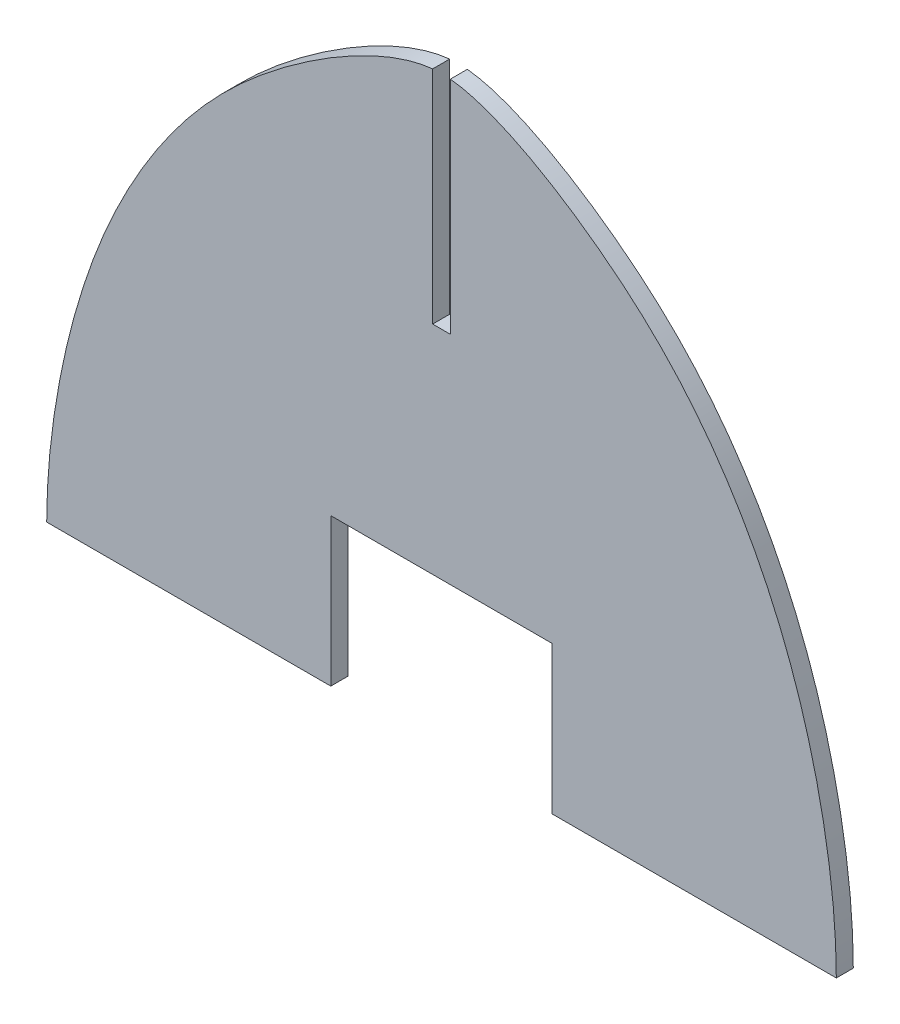
ISO-10303-21;
HEADER;
FILE_DESCRIPTION(('STEP AP214'),'2;1');
FILE_NAME('part.step','',(''),(''),'','','');
FILE_SCHEMA(('AUTOMOTIVE_DESIGN { 1 0 10303 214 1 1 1 1 }'));
ENDSEC;
DATA;
#1=APPLICATION_CONTEXT('core data for automotive mechanical design processes');
#2=APPLICATION_PROTOCOL_DEFINITION('international standard','automotive_design',2000,#1);
#3=PRODUCT_CONTEXT('',#1,'mechanical');
#4=PRODUCT('Part','Part','',(#3));
#5=PRODUCT_RELATED_PRODUCT_CATEGORY('part','',(#4));
#6=PRODUCT_DEFINITION_FORMATION('','',#4);
#7=PRODUCT_DEFINITION_CONTEXT('part definition',#1,'design');
#8=PRODUCT_DEFINITION('design','',#6,#7);
#9=PRODUCT_DEFINITION_SHAPE('','',#8);
#10=(LENGTH_UNIT() NAMED_UNIT(*) SI_UNIT(.MILLI.,.METRE.));
#11=(NAMED_UNIT(*) PLANE_ANGLE_UNIT() SI_UNIT($,.RADIAN.));
#12=(NAMED_UNIT(*) SI_UNIT($,.STERADIAN.) SOLID_ANGLE_UNIT());
#13=UNCERTAINTY_MEASURE_WITH_UNIT(LENGTH_MEASURE(1.E-05),#10,'distance_accuracy_value','');
#14=(GEOMETRIC_REPRESENTATION_CONTEXT(3) GLOBAL_UNCERTAINTY_ASSIGNED_CONTEXT((#13)) GLOBAL_UNIT_ASSIGNED_CONTEXT((#10,
#11,#12)) REPRESENTATION_CONTEXT('',''));
#15=CARTESIAN_POINT('',(0.,0.,0.));
#16=DIRECTION('',(0.,0.,1.));
#17=DIRECTION('',(1.,0.,0.));
#18=AXIS2_PLACEMENT_3D('',#15,#16,#17);
#19=CARTESIAN_POINT('',(101.35726270101,164.25702439015,5.842));
#20=DIRECTION('',(0.,0.,1.));
#21=DIRECTION('',(1.,0.,0.));
#22=AXIS2_PLACEMENT_3D('',#19,#20,#21);
#23=PLANE('',#22);
#24=DIRECTION('',(0.,1.,0.));
#25=VECTOR('',#24,1.);
#26=CARTESIAN_POINT('',(3.048,241.3,5.842));
#27=LINE('',#26,#25);
#28=CARTESIAN_POINT('',(3.04800000000001,165.1,5.842));
#29=VERTEX_POINT('',#28);
#30=CARTESIAN_POINT('',(3.04799999980485,241.141961047709,5.842));
#31=VERTEX_POINT('',#30);
#32=EDGE_CURVE('E48',#29,#31,#27,.T.);
#33=ORIENTED_EDGE('',*,*,#32,.F.);
#34=DIRECTION('',(1.,0.,0.));
#35=VECTOR('',#34,1.);
#36=CARTESIAN_POINT('',(0.,165.1,5.842));
#37=LINE('',#36,#35);
#38=CARTESIAN_POINT('',(-3.04800000000001,165.1,5.842));
#39=VERTEX_POINT('',#38);
#40=EDGE_CURVE('E111',#39,#29,#37,.T.);
#41=ORIENTED_EDGE('',*,*,#40,.F.);
#42=DIRECTION('',(0.,1.,0.));
#43=VECTOR('',#42,1.);
#44=CARTESIAN_POINT('',(-3.048,241.3,5.842));
#45=LINE('',#44,#43);
#46=CARTESIAN_POINT('',(-3.04799999980485,241.141961047709,5.842));
#47=VERTEX_POINT('',#46);
#48=EDGE_CURVE('E115',#39,#47,#45,.T.);
#49=ORIENTED_EDGE('',*,*,#48,.T.);
#50=CARTESIAN_POINT('',(-135.847173209284,39.6875,5.842));
#51=CARTESIAN_POINT('',(-135.847173209284,66.0913289734383,5.842));
#52=CARTESIAN_POINT('',(-127.183964055837,115.738105555344,5.842));
#53=CARTESIAN_POINT('',(-96.7697664193962,175.903175741918,5.842));
#54=CARTESIAN_POINT('',(-59.624010151385,216.373546587046,5.842));
#55=CARTESIAN_POINT('',(-14.7383543797636,241.3,5.842));
#56=CARTESIAN_POINT('',(0.,241.3,5.842));
#57=B_SPLINE_CURVE_WITH_KNOTS('',3,(#50,#51,#52,#53,#54,#55,#56),.UNSPECIFIED.,.F.,.F.,(4,1,1,1,
4),(0.,0.338781958063349,0.527407096560456,0.772270466293324,1.),.UNSPECIFIED.);
#58=CARTESIAN_POINT('',(-135.847173209284,39.6875,5.842));
#59=VERTEX_POINT('',#58);
#60=EDGE_CURVE('E147',#59,#47,#57,.T.);
#61=ORIENTED_EDGE('',*,*,#60,.F.);
#62=DIRECTION('',(-1.,0.,0.));
#63=VECTOR('',#62,1.);
#64=CARTESIAN_POINT('',(0.,39.6875,5.842));
#65=LINE('',#64,#63);
#66=CARTESIAN_POINT('',(-38.1,39.6875,5.842));
#67=VERTEX_POINT('',#66);
#68=EDGE_CURVE('E152',#67,#59,#65,.T.);
#69=ORIENTED_EDGE('',*,*,#68,.F.);
#70=DIRECTION('',(0.,1.,0.));
#71=VECTOR('',#70,1.);
#72=CARTESIAN_POINT('',(-38.1,39.6875,5.842));
#73=LINE('',#72,#71);
#74=CARTESIAN_POINT('',(-38.1,90.4875,5.842));
#75=VERTEX_POINT('',#74);
#76=EDGE_CURVE('E136',#67,#75,#73,.T.);
#77=ORIENTED_EDGE('',*,*,#76,.T.);
#78=DIRECTION('',(-1.,0.,0.));
#79=VECTOR('',#78,1.);
#80=CARTESIAN_POINT('',(0.,90.4875,5.842));
#81=LINE('',#80,#79);
#82=CARTESIAN_POINT('',(38.1,90.4875,5.842));
#83=VERTEX_POINT('',#82);
#84=EDGE_CURVE('E219',#83,#75,#81,.T.);
#85=ORIENTED_EDGE('',*,*,#84,.F.);
#86=DIRECTION('',(0.,1.,0.));
#87=VECTOR('',#86,1.);
#88=CARTESIAN_POINT('',(38.1,39.6875,5.842));
#89=LINE('',#88,#87);
#90=CARTESIAN_POINT('',(38.1,39.6875,5.842));
#91=VERTEX_POINT('',#90);
#92=EDGE_CURVE('E222',#91,#83,#89,.T.);
#93=ORIENTED_EDGE('',*,*,#92,.F.);
#94=DIRECTION('',(1.,0.,0.));
#95=VECTOR('',#94,1.);
#96=CARTESIAN_POINT('',(0.,39.6875,5.842));
#97=LINE('',#96,#95);
#98=CARTESIAN_POINT('',(135.847173209284,39.6875,5.842));
#99=VERTEX_POINT('',#98);
#100=EDGE_CURVE('E57',#91,#99,#97,.T.);
#101=ORIENTED_EDGE('',*,*,#100,.T.);
#102=CARTESIAN_POINT('',(135.847173209284,39.6875,5.842));
#103=CARTESIAN_POINT('',(135.847173209284,66.0913289734383,5.842));
#104=CARTESIAN_POINT('',(127.183964055837,115.738105555344,5.842));
#105=CARTESIAN_POINT('',(96.7697664193962,175.903175741918,5.842));
#106=CARTESIAN_POINT('',(59.624010151385,216.373546587046,5.842));
#107=CARTESIAN_POINT('',(14.7383543797636,241.3,5.842));
#108=CARTESIAN_POINT('',(0.,241.3,5.842));
#109=B_SPLINE_CURVE_WITH_KNOTS('',3,(#102,#103,#104,#105,#106,#107,#108),.UNSPECIFIED.,.F.,.F.,
(4,1,1,1,4),(0.,0.338781958063349,0.527407096560456,0.772270466293324,1.),.UNSPECIFIED.);
#110=EDGE_CURVE('E204',#99,#31,#109,.T.);
#111=ORIENTED_EDGE('',*,*,#110,.T.);
#112=EDGE_LOOP('',(#33,#41,#49,#61,#69,#77,#85,#93,#101,#111));
#113=FACE_BOUND('',#112,.T.);
#114=ADVANCED_FACE('F33',(#113),#23,.T.);
#115=CARTESIAN_POINT('',(101.35726270101,164.25702439015,0.));
#116=DIRECTION('',(0.,0.,1.));
#117=DIRECTION('',(1.,0.,0.));
#118=AXIS2_PLACEMENT_3D('',#115,#116,#117);
#119=PLANE('',#118);
#120=DIRECTION('',(1.,0.,0.));
#121=VECTOR('',#120,1.);
#122=CARTESIAN_POINT('',(0.,165.1,0.));
#123=LINE('',#122,#121);
#124=CARTESIAN_POINT('',(-3.04800000000001,165.1,0.));
#125=VERTEX_POINT('',#124);
#126=CARTESIAN_POINT('',(3.04800000000001,165.1,0.));
#127=VERTEX_POINT('',#126);
#128=EDGE_CURVE('E123',#125,#127,#123,.T.);
#129=ORIENTED_EDGE('',*,*,#128,.T.);
#130=DIRECTION('',(0.,1.,0.));
#131=VECTOR('',#130,1.);
#132=CARTESIAN_POINT('',(3.048,241.3,0.));
#133=LINE('',#132,#131);
#134=CARTESIAN_POINT('',(3.048,241.141961047709,0.));
#135=VERTEX_POINT('',#134);
#136=EDGE_CURVE('E117',#127,#135,#133,.T.);
#137=ORIENTED_EDGE('',*,*,#136,.T.);
#138=CARTESIAN_POINT('',(135.847173209284,39.6875,0.));
#139=CARTESIAN_POINT('',(135.847173209284,66.0913289734383,0.));
#140=CARTESIAN_POINT('',(127.183964055837,115.738105555344,0.));
#141=CARTESIAN_POINT('',(96.7697664193962,175.903175741918,0.));
#142=CARTESIAN_POINT('',(59.624010151385,216.373546587046,0.));
#143=CARTESIAN_POINT('',(14.7383543797636,241.3,0.));
#144=CARTESIAN_POINT('',(0.,241.3,0.));
#145=B_SPLINE_CURVE_WITH_KNOTS('',3,(#138,#139,#140,#141,#142,#143,#144),.UNSPECIFIED.,.F.,.F.,
(4,1,1,1,4),(0.,0.338781958063349,0.527407096560456,0.772270466293324,1.),.UNSPECIFIED.);
#146=CARTESIAN_POINT('',(135.847173209284,39.6875,0.));
#147=VERTEX_POINT('',#146);
#148=EDGE_CURVE('E196',#147,#135,#145,.T.);
#149=ORIENTED_EDGE('',*,*,#148,.F.);
#150=DIRECTION('',(1.,0.,0.));
#151=VECTOR('',#150,1.);
#152=CARTESIAN_POINT('',(0.,39.6875,0.));
#153=LINE('',#152,#151);
#154=CARTESIAN_POINT('',(38.1,39.6875,0.));
#155=VERTEX_POINT('',#154);
#156=EDGE_CURVE('E194',#155,#147,#153,.T.);
#157=ORIENTED_EDGE('',*,*,#156,.F.);
#158=DIRECTION('',(0.,1.,0.));
#159=VECTOR('',#158,1.);
#160=CARTESIAN_POINT('',(38.1,39.6875,0.));
#161=LINE('',#160,#159);
#162=CARTESIAN_POINT('',(38.1,90.4875,0.));
#163=VERTEX_POINT('',#162);
#164=EDGE_CURVE('E201',#155,#163,#161,.T.);
#165=ORIENTED_EDGE('',*,*,#164,.T.);
#166=DIRECTION('',(-1.,0.,0.));
#167=VECTOR('',#166,1.);
#168=CARTESIAN_POINT('',(0.,90.4875,0.));
#169=LINE('',#168,#167);
#170=CARTESIAN_POINT('',(-38.1,90.4875,0.));
#171=VERTEX_POINT('',#170);
#172=EDGE_CURVE('E220',#163,#171,#169,.T.);
#173=ORIENTED_EDGE('',*,*,#172,.T.);
#174=DIRECTION('',(0.,1.,0.));
#175=VECTOR('',#174,1.);
#176=CARTESIAN_POINT('',(-38.1,39.6875,0.));
#177=LINE('',#176,#175);
#178=CARTESIAN_POINT('',(-38.1,39.6875,0.));
#179=VERTEX_POINT('',#178);
#180=EDGE_CURVE('E127',#179,#171,#177,.T.);
#181=ORIENTED_EDGE('',*,*,#180,.F.);
#182=DIRECTION('',(-1.,0.,0.));
#183=VECTOR('',#182,1.);
#184=CARTESIAN_POINT('',(0.,39.6875,0.));
#185=LINE('',#184,#183);
#186=CARTESIAN_POINT('',(-135.847173209284,39.6875,0.));
#187=VERTEX_POINT('',#186);
#188=EDGE_CURVE('E153',#179,#187,#185,.T.);
#189=ORIENTED_EDGE('',*,*,#188,.T.);
#190=CARTESIAN_POINT('',(-135.847173209284,39.6875,0.));
#191=CARTESIAN_POINT('',(-135.847173209284,66.0913289734383,0.));
#192=CARTESIAN_POINT('',(-127.183964055837,115.738105555344,0.));
#193=CARTESIAN_POINT('',(-96.7697664193962,175.903175741918,0.));
#194=CARTESIAN_POINT('',(-59.624010151385,216.373546587046,0.));
#195=CARTESIAN_POINT('',(-14.7383543797636,241.3,0.));
#196=CARTESIAN_POINT('',(0.,241.3,0.));
#197=B_SPLINE_CURVE_WITH_KNOTS('',3,(#190,#191,#192,#193,#194,#195,#196),.UNSPECIFIED.,.F.,.F.,
(4,1,1,1,4),(0.,0.338781958063349,0.527407096560456,0.772270466293324,1.),.UNSPECIFIED.);
#198=CARTESIAN_POINT('',(-3.048,241.141961047709,0.));
#199=VERTEX_POINT('',#198);
#200=EDGE_CURVE('E146',#187,#199,#197,.T.);
#201=ORIENTED_EDGE('',*,*,#200,.T.);
#202=DIRECTION('',(0.,1.,0.));
#203=VECTOR('',#202,1.);
#204=CARTESIAN_POINT('',(-3.048,241.3,0.));
#205=LINE('',#204,#203);
#206=EDGE_CURVE('E132',#125,#199,#205,.T.);
#207=ORIENTED_EDGE('',*,*,#206,.F.);
#208=EDGE_LOOP('',(#129,#137,#149,#157,#165,#173,#181,#189,#201,#207));
#209=FACE_BOUND('',#208,.T.);
#210=ADVANCED_FACE('F182',(#209),#119,.F.);
#211=DIRECTION('',(0.,0.,-1.));
#212=VECTOR('',#211,1.);
#213=SURFACE_OF_LINEAR_EXTRUSION('',#109,#212);
#214=DIRECTION('',(0.,0.,-1.));
#215=VECTOR('',#214,1.);
#216=CARTESIAN_POINT('',(3.04799999999999,241.14196104769,5.842));
#217=LINE('',#216,#215);
#218=EDGE_CURVE('E11',#31,#135,#217,.T.);
#219=ORIENTED_EDGE('',*,*,#218,.F.);
#220=ORIENTED_EDGE('',*,*,#110,.F.);
#221=DIRECTION('',(0.,0.,-1.));
#222=VECTOR('',#221,1.);
#223=CARTESIAN_POINT('',(135.847173209284,39.6875,5.842));
#224=LINE('',#223,#222);
#225=EDGE_CURVE('E42',#99,#147,#224,.T.);
#226=ORIENTED_EDGE('',*,*,#225,.T.);
#227=ORIENTED_EDGE('',*,*,#148,.T.);
#228=EDGE_LOOP('',(#219,#220,#226,#227));
#229=FACE_BOUND('',#228,.T.);
#230=ADVANCED_FACE('F35',(#229),#213,.F.);
#231=CARTESIAN_POINT('',(0.,39.6875,5.842));
#232=DIRECTION('',(0.,1.,0.));
#233=DIRECTION('',(0.,0.,1.));
#234=AXIS2_PLACEMENT_3D('',#231,#232,#233);
#235=PLANE('',#234);
#236=DIRECTION('',(0.,0.,-1.));
#237=VECTOR('',#236,1.);
#238=CARTESIAN_POINT('',(38.1,39.6875,5.842));
#239=LINE('',#238,#237);
#240=EDGE_CURVE('E192',#91,#155,#239,.T.);
#241=ORIENTED_EDGE('',*,*,#240,.T.);
#242=ORIENTED_EDGE('',*,*,#156,.T.);
#243=ORIENTED_EDGE('',*,*,#225,.F.);
#244=ORIENTED_EDGE('',*,*,#100,.F.);
#245=EDGE_LOOP('',(#241,#242,#243,#244));
#246=FACE_BOUND('',#245,.T.);
#247=ADVANCED_FACE('F178',(#246),#235,.F.);
#248=CARTESIAN_POINT('',(38.1,39.6875,5.842));
#249=DIRECTION('',(-1.,0.,0.));
#250=DIRECTION('',(0.,0.,1.));
#251=AXIS2_PLACEMENT_3D('',#248,#249,#250);
#252=PLANE('',#251);
#253=ORIENTED_EDGE('',*,*,#164,.F.);
#254=ORIENTED_EDGE('',*,*,#240,.F.);
#255=ORIENTED_EDGE('',*,*,#92,.T.);
#256=DIRECTION('',(0.,0.,-1.));
#257=VECTOR('',#256,1.);
#258=CARTESIAN_POINT('',(38.1,90.4875,5.842));
#259=LINE('',#258,#257);
#260=EDGE_CURVE('E197',#83,#163,#259,.T.);
#261=ORIENTED_EDGE('',*,*,#260,.T.);
#262=EDGE_LOOP('',(#253,#254,#255,#261));
#263=FACE_BOUND('',#262,.T.);
#264=ADVANCED_FACE('F174',(#263),#252,.T.);
#265=CARTESIAN_POINT('',(0.,90.4875,5.842));
#266=DIRECTION('',(0.,-1.,0.));
#267=DIRECTION('',(0.,0.,-1.));
#268=AXIS2_PLACEMENT_3D('',#265,#266,#267);
#269=PLANE('',#268);
#270=ORIENTED_EDGE('',*,*,#172,.F.);
#271=ORIENTED_EDGE('',*,*,#260,.F.);
#272=ORIENTED_EDGE('',*,*,#84,.T.);
#273=DIRECTION('',(0.,0.,-1.));
#274=VECTOR('',#273,1.);
#275=CARTESIAN_POINT('',(-38.1,90.4875,5.842));
#276=LINE('',#275,#274);
#277=EDGE_CURVE('E139',#75,#171,#276,.T.);
#278=ORIENTED_EDGE('',*,*,#277,.T.);
#279=EDGE_LOOP('',(#270,#271,#272,#278));
#280=FACE_BOUND('',#279,.T.);
#281=ADVANCED_FACE('F169',(#280),#269,.T.);
#282=CARTESIAN_POINT('',(3.048,241.3,5.842));
#283=DIRECTION('',(-1.,0.,0.));
#284=DIRECTION('',(0.,-1.,0.));
#285=AXIS2_PLACEMENT_3D('',#282,#283,#284);
#286=PLANE('',#285);
#287=ORIENTED_EDGE('',*,*,#218,.T.);
#288=ORIENTED_EDGE('',*,*,#136,.F.);
#289=DIRECTION('',(0.,0.,-1.));
#290=VECTOR('',#289,1.);
#291=CARTESIAN_POINT('',(3.04800000000001,165.1,5.842));
#292=LINE('',#291,#290);
#293=EDGE_CURVE('E224',#29,#127,#292,.T.);
#294=ORIENTED_EDGE('',*,*,#293,.F.);
#295=ORIENTED_EDGE('',*,*,#32,.T.);
#296=EDGE_LOOP('',(#287,#288,#294,#295));
#297=FACE_BOUND('',#296,.T.);
#298=ADVANCED_FACE('F166',(#297),#286,.T.);
#299=CARTESIAN_POINT('',(0.,165.1,5.842));
#300=DIRECTION('',(0.,1.,0.));
#301=DIRECTION('',(0.,0.,1.));
#302=AXIS2_PLACEMENT_3D('',#299,#300,#301);
#303=PLANE('',#302);
#304=ORIENTED_EDGE('',*,*,#128,.F.);
#305=DIRECTION('',(0.,0.,-1.));
#306=VECTOR('',#305,1.);
#307=CARTESIAN_POINT('',(-3.04800000000001,165.1,5.842));
#308=LINE('',#307,#306);
#309=EDGE_CURVE('E120',#39,#125,#308,.T.);
#310=ORIENTED_EDGE('',*,*,#309,.F.);
#311=ORIENTED_EDGE('',*,*,#40,.T.);
#312=ORIENTED_EDGE('',*,*,#293,.T.);
#313=EDGE_LOOP('',(#304,#310,#311,#312));
#314=FACE_BOUND('',#313,.T.);
#315=ADVANCED_FACE('F121',(#314),#303,.T.);
#316=DIRECTION('',(0.,0.,-1.));
#317=VECTOR('',#316,1.);
#318=SURFACE_OF_LINEAR_EXTRUSION('',#57,#317);
#319=DIRECTION('',(0.,0.,-1.));
#320=VECTOR('',#319,1.);
#321=CARTESIAN_POINT('',(-3.04799999999999,241.14196104769,5.842));
#322=LINE('',#321,#320);
#323=EDGE_CURVE('E130',#47,#199,#322,.T.);
#324=ORIENTED_EDGE('',*,*,#323,.T.);
#325=ORIENTED_EDGE('',*,*,#200,.F.);
#326=DIRECTION('',(0.,0.,-1.));
#327=VECTOR('',#326,1.);
#328=CARTESIAN_POINT('',(-135.847173209284,39.6875,5.842));
#329=LINE('',#328,#327);
#330=EDGE_CURVE('E232',#59,#187,#329,.T.);
#331=ORIENTED_EDGE('',*,*,#330,.F.);
#332=ORIENTED_EDGE('',*,*,#60,.T.);
#333=EDGE_LOOP('',(#324,#325,#331,#332));
#334=FACE_BOUND('',#333,.T.);
#335=ADVANCED_FACE('F159',(#334),#318,.T.);
#336=CARTESIAN_POINT('',(0.,39.6875,5.842));
#337=DIRECTION('',(0.,1.,0.));
#338=DIRECTION('',(0.,0.,1.));
#339=AXIS2_PLACEMENT_3D('',#336,#337,#338);
#340=PLANE('',#339);
#341=DIRECTION('',(0.,0.,-1.));
#342=VECTOR('',#341,1.);
#343=CARTESIAN_POINT('',(-38.1,39.6875,5.842));
#344=LINE('',#343,#342);
#345=EDGE_CURVE('E144',#67,#179,#344,.T.);
#346=ORIENTED_EDGE('',*,*,#345,.F.);
#347=ORIENTED_EDGE('',*,*,#68,.T.);
#348=ORIENTED_EDGE('',*,*,#330,.T.);
#349=ORIENTED_EDGE('',*,*,#188,.F.);
#350=EDGE_LOOP('',(#346,#347,#348,#349));
#351=FACE_BOUND('',#350,.T.);
#352=ADVANCED_FACE('F163',(#351),#340,.F.);
#353=CARTESIAN_POINT('',(-38.1,39.6875,5.842));
#354=DIRECTION('',(1.,0.,0.));
#355=DIRECTION('',(0.,0.,1.));
#356=AXIS2_PLACEMENT_3D('',#353,#354,#355);
#357=PLANE('',#356);
#358=ORIENTED_EDGE('',*,*,#180,.T.);
#359=ORIENTED_EDGE('',*,*,#277,.F.);
#360=ORIENTED_EDGE('',*,*,#76,.F.);
#361=ORIENTED_EDGE('',*,*,#345,.T.);
#362=EDGE_LOOP('',(#358,#359,#360,#361));
#363=FACE_BOUND('',#362,.T.);
#364=ADVANCED_FACE('F251',(#363),#357,.T.);
#365=CARTESIAN_POINT('',(-3.048,241.3,5.842));
#366=DIRECTION('',(1.,0.,0.));
#367=DIRECTION('',(0.,-1.,0.));
#368=AXIS2_PLACEMENT_3D('',#365,#366,#367);
#369=PLANE('',#368);
#370=ORIENTED_EDGE('',*,*,#323,.F.);
#371=ORIENTED_EDGE('',*,*,#48,.F.);
#372=ORIENTED_EDGE('',*,*,#309,.T.);
#373=ORIENTED_EDGE('',*,*,#206,.T.);
#374=EDGE_LOOP('',(#370,#371,#372,#373));
#375=FACE_BOUND('',#374,.T.);
#376=ADVANCED_FACE('F129',(#375),#369,.T.);
#377=CLOSED_SHELL('',(#114,#210,#230,#247,#264,#281,#298,#315,#335,#352,#364,#376));
#378=MANIFOLD_SOLID_BREP('B2',#377);
#379=ADVANCED_BREP_SHAPE_REPRESENTATION('',(#18,#378),#14);
#380=SHAPE_DEFINITION_REPRESENTATION(#9,#379);
ENDSEC;
END-ISO-10303-21;
